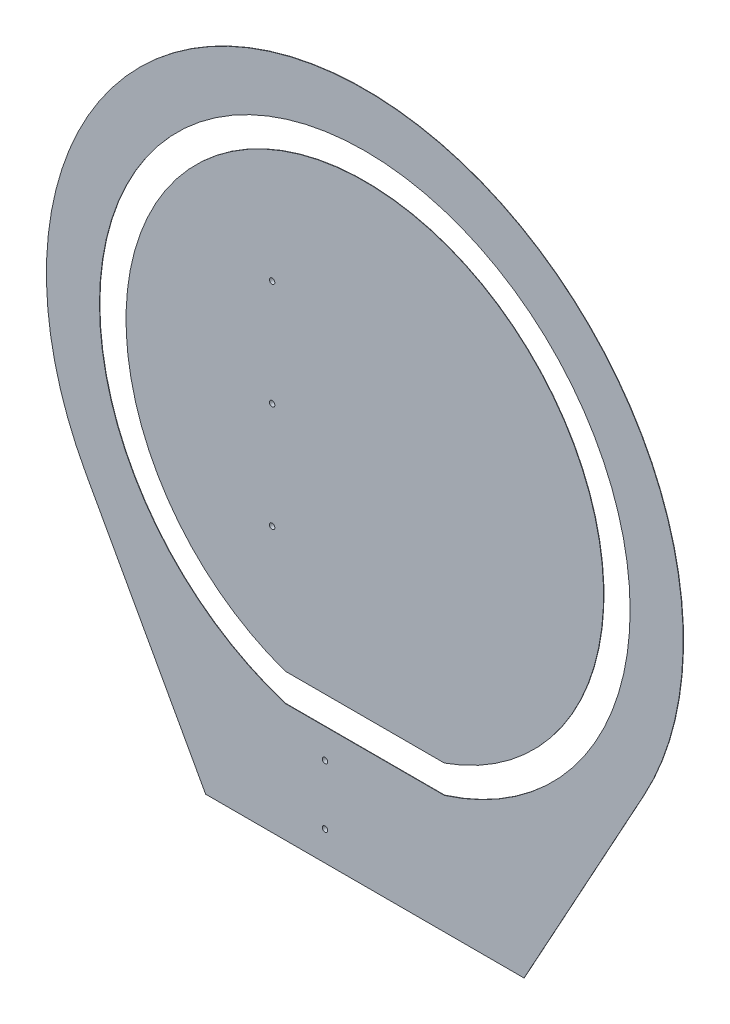
ISO-10303-21;
HEADER;
FILE_DESCRIPTION(('STEP AP214'),'2;1');
FILE_NAME('part.step','',(''),(''),'','','');
FILE_SCHEMA(('AUTOMOTIVE_DESIGN { 1 0 10303 214 1 1 1 1 }'));
ENDSEC;
DATA;
#1=APPLICATION_CONTEXT('core data for automotive mechanical design processes');
#2=APPLICATION_PROTOCOL_DEFINITION('international standard','automotive_design',2000,#1);
#3=PRODUCT_CONTEXT('',#1,'mechanical');
#4=PRODUCT('Part','Part','',(#3));
#5=PRODUCT_RELATED_PRODUCT_CATEGORY('part','',(#4));
#6=PRODUCT_DEFINITION_FORMATION('','',#4);
#7=PRODUCT_DEFINITION_CONTEXT('part definition',#1,'design');
#8=PRODUCT_DEFINITION('design','',#6,#7);
#9=PRODUCT_DEFINITION_SHAPE('','',#8);
#10=(LENGTH_UNIT() NAMED_UNIT(*) SI_UNIT(.MILLI.,.METRE.));
#11=(NAMED_UNIT(*) PLANE_ANGLE_UNIT() SI_UNIT($,.RADIAN.));
#12=(NAMED_UNIT(*) SI_UNIT($,.STERADIAN.) SOLID_ANGLE_UNIT());
#13=UNCERTAINTY_MEASURE_WITH_UNIT(LENGTH_MEASURE(1.E-05),#10,'distance_accuracy_value','');
#14=(GEOMETRIC_REPRESENTATION_CONTEXT(3) GLOBAL_UNCERTAINTY_ASSIGNED_CONTEXT((#13)) GLOBAL_UNIT_ASSIGNED_CONTEXT((#10,
#11,#12)) REPRESENTATION_CONTEXT('',''));
#15=CARTESIAN_POINT('',(0.,0.,0.));
#16=DIRECTION('',(0.,0.,1.));
#17=DIRECTION('',(1.,0.,0.));
#18=AXIS2_PLACEMENT_3D('',#15,#16,#17);
#19=CARTESIAN_POINT('',(0.,0.,0.));
#20=DIRECTION('',(0.,0.,1.));
#21=DIRECTION('',(1.,0.,0.));
#22=AXIS2_PLACEMENT_3D('',#19,#20,#21);
#23=PLANE('',#22);
#24=CARTESIAN_POINT('',(-3.7500000022113,-26.6242400340328,0.));
#25=DIRECTION('',(0.,0.,1.));
#26=DIRECTION('',(1.,0.,0.));
#27=AXIS2_PLACEMENT_3D('',#24,#25,#26);
#28=CIRCLE('',#27,0.27178);
#29=CARTESIAN_POINT('',(-3.4782200022113,-26.6242400340328,0.));
#30=VERTEX_POINT('',#29);
#31=EDGE_CURVE('E82',#30,#30,#28,.F.);
#32=ORIENTED_EDGE('',*,*,#31,.F.);
#33=EDGE_LOOP('',(#32));
#34=FACE_BOUND('',#33,.T.);
#35=DIRECTION('',(1.,0.,0.));
#36=VECTOR('',#35,1.);
#37=CARTESIAN_POINT('',(0.,-35.0000000340328,0.));
#38=LINE('',#37,#36);
#39=CARTESIAN_POINT('',(-15.,-35.0000000340328,0.));
#40=VERTEX_POINT('',#39);
#41=CARTESIAN_POINT('',(15.,-35.0000000340328,0.));
#42=VERTEX_POINT('',#41);
#43=EDGE_CURVE('E163',#40,#42,#38,.T.);
#44=ORIENTED_EDGE('',*,*,#43,.F.);
#45=DIRECTION('',(-0.481530218707047,0.876429488591035,0.));
#46=VECTOR('',#45,1.);
#47=CARTESIAN_POINT('',(-26.2928846577311,-14.4459065612114,0.));
#48=LINE('',#47,#46);
#49=CARTESIAN_POINT('',(-26.2928846577311,-14.4459065612114,0.));
#50=VERTEX_POINT('',#49);
#51=EDGE_CURVE('E138',#40,#50,#48,.T.);
#52=ORIENTED_EDGE('',*,*,#51,.T.);
#53=CARTESIAN_POINT('',(0.,0.,0.));
#54=DIRECTION('',(0.,0.,1.));
#55=DIRECTION('',(1.,0.,0.));
#56=AXIS2_PLACEMENT_3D('',#53,#54,#55);
#57=CIRCLE('',#56,30.);
#58=CARTESIAN_POINT('',(26.2928846577311,-14.4459065612114,0.));
#59=VERTEX_POINT('',#58);
#60=EDGE_CURVE('E168',#59,#50,#57,.T.);
#61=ORIENTED_EDGE('',*,*,#60,.F.);
#62=DIRECTION('',(0.481530218707047,0.876429488591035,0.));
#63=VECTOR('',#62,1.);
#64=CARTESIAN_POINT('',(26.2928846577311,-14.4459065612114,0.));
#65=LINE('',#64,#63);
#66=EDGE_CURVE('E165',#42,#59,#65,.T.);
#67=ORIENTED_EDGE('',*,*,#66,.F.);
#68=EDGE_LOOP('',(#44,#52,#61,#67));
#69=FACE_BOUND('',#68,.T.);
#70=CARTESIAN_POINT('',(0.,0.,0.));
#71=DIRECTION('',(0.,0.,1.));
#72=DIRECTION('',(1.,0.,0.));
#73=AXIS2_PLACEMENT_3D('',#70,#71,#72);
#74=CIRCLE('',#73,25.);
#75=CARTESIAN_POINT('',(7.50000000442261,-23.8484800340328,0.));
#76=VERTEX_POINT('',#75);
#77=CARTESIAN_POINT('',(-7.50000000442261,-23.8484800340328,0.));
#78=VERTEX_POINT('',#77);
#79=EDGE_CURVE('E172',#76,#78,#74,.T.);
#80=ORIENTED_EDGE('',*,*,#79,.T.);
#81=DIRECTION('',(1.,0.,0.));
#82=VECTOR('',#81,1.);
#83=CARTESIAN_POINT('',(0.,-23.8484800340328,0.));
#84=LINE('',#83,#82);
#85=EDGE_CURVE('E149',#78,#76,#84,.T.);
#86=ORIENTED_EDGE('',*,*,#85,.T.);
#87=EDGE_LOOP('',(#80,#86));
#88=FACE_BOUND('',#87,.T.);
#89=CARTESIAN_POINT('',(-3.7500000022113,-32.2242400340328,0.));
#90=DIRECTION('',(0.,0.,1.));
#91=DIRECTION('',(1.,0.,0.));
#92=AXIS2_PLACEMENT_3D('',#89,#90,#91);
#93=CIRCLE('',#92,0.271780000000001);
#94=CARTESIAN_POINT('',(-3.4782200022113,-32.2242400340328,0.));
#95=VERTEX_POINT('',#94);
#96=EDGE_CURVE('E13',#95,#95,#93,.F.);
#97=ORIENTED_EDGE('',*,*,#96,.F.);
#98=EDGE_LOOP('',(#97));
#99=FACE_BOUND('',#98,.T.);
#100=ADVANCED_FACE('F73',(#34,#69,#88,#99),#23,.F.);
#101=CARTESIAN_POINT('',(0.,0.,0.03556));
#102=DIRECTION('',(0.,0.,-1.));
#103=DIRECTION('',(-1.,0.,0.));
#104=AXIS2_PLACEMENT_3D('',#101,#102,#103);
#105=CYLINDRICAL_SURFACE('',#104,25.);
#106=ORIENTED_EDGE('',*,*,#79,.F.);
#107=DIRECTION('',(0.,0.,-1.));
#108=VECTOR('',#107,1.);
#109=CARTESIAN_POINT('',(7.50000000442261,-23.8484800340328,0.03556));
#110=LINE('',#109,#108);
#111=CARTESIAN_POINT('',(7.50000000442261,-23.8484800340328,0.03556));
#112=VERTEX_POINT('',#111);
#113=EDGE_CURVE('E110',#112,#76,#110,.T.);
#114=ORIENTED_EDGE('',*,*,#113,.F.);
#115=CARTESIAN_POINT('',(0.,0.,0.03556));
#116=DIRECTION('',(0.,0.,1.));
#117=DIRECTION('',(1.,0.,0.));
#118=AXIS2_PLACEMENT_3D('',#115,#116,#117);
#119=CIRCLE('',#118,25.);
#120=CARTESIAN_POINT('',(-7.50000000442261,-23.8484800340328,0.03556));
#121=VERTEX_POINT('',#120);
#122=EDGE_CURVE('E156',#112,#121,#119,.T.);
#123=ORIENTED_EDGE('',*,*,#122,.T.);
#124=DIRECTION('',(0.,0.,-1.));
#125=VECTOR('',#124,1.);
#126=CARTESIAN_POINT('',(-7.50000000442261,-23.8484800340328,0.03556));
#127=LINE('',#126,#125);
#128=EDGE_CURVE('E90',#121,#78,#127,.T.);
#129=ORIENTED_EDGE('',*,*,#128,.T.);
#130=EDGE_LOOP('',(#106,#114,#123,#129));
#131=FACE_BOUND('',#130,.T.);
#132=ADVANCED_FACE('F189',(#131),#105,.F.);
#133=CARTESIAN_POINT('',(0.,-35.0000000340328,0.03556));
#134=DIRECTION('',(0.,1.,0.));
#135=DIRECTION('',(-1.,0.,0.));
#136=AXIS2_PLACEMENT_3D('',#133,#134,#135);
#137=PLANE('',#136);
#138=ORIENTED_EDGE('',*,*,#43,.T.);
#139=DIRECTION('',(0.,0.,-1.));
#140=VECTOR('',#139,1.);
#141=CARTESIAN_POINT('',(15.,-35.0000000340328,0.03556));
#142=LINE('',#141,#140);
#143=CARTESIAN_POINT('',(15.,-35.0000000340328,0.03556));
#144=VERTEX_POINT('',#143);
#145=EDGE_CURVE('E147',#144,#42,#142,.T.);
#146=ORIENTED_EDGE('',*,*,#145,.F.);
#147=DIRECTION('',(1.,0.,0.));
#148=VECTOR('',#147,1.);
#149=CARTESIAN_POINT('',(0.,-35.0000000340328,0.03556));
#150=LINE('',#149,#148);
#151=CARTESIAN_POINT('',(-15.,-35.0000000340328,0.03556));
#152=VERTEX_POINT('',#151);
#153=EDGE_CURVE('E146',#152,#144,#150,.T.);
#154=ORIENTED_EDGE('',*,*,#153,.F.);
#155=DIRECTION('',(0.,0.,-1.));
#156=VECTOR('',#155,1.);
#157=CARTESIAN_POINT('',(-15.,-35.0000000340328,0.03556));
#158=LINE('',#157,#156);
#159=EDGE_CURVE('E132',#152,#40,#158,.T.);
#160=ORIENTED_EDGE('',*,*,#159,.T.);
#161=EDGE_LOOP('',(#138,#146,#154,#160));
#162=FACE_BOUND('',#161,.T.);
#163=ADVANCED_FACE('F75',(#162),#137,.F.);
#164=CARTESIAN_POINT('',(26.2928846577311,-14.4459065612114,0.03556));
#165=DIRECTION('',(-0.876429488591035,0.481530218707047,0.));
#166=DIRECTION('',(-0.481530218707047,-0.876429488591036,0.));
#167=AXIS2_PLACEMENT_3D('',#164,#165,#166);
#168=PLANE('',#167);
#169=ORIENTED_EDGE('',*,*,#66,.T.);
#170=DIRECTION('',(0.,0.,-1.));
#171=VECTOR('',#170,1.);
#172=CARTESIAN_POINT('',(26.2928846577311,-14.4459065612114,0.03556));
#173=LINE('',#172,#171);
#174=CARTESIAN_POINT('',(26.2928846577311,-14.4459065612114,0.03556));
#175=VERTEX_POINT('',#174);
#176=EDGE_CURVE('E179',#175,#59,#173,.T.);
#177=ORIENTED_EDGE('',*,*,#176,.F.);
#178=DIRECTION('',(0.481530218707047,0.876429488591035,0.));
#179=VECTOR('',#178,1.);
#180=CARTESIAN_POINT('',(26.2928846577311,-14.4459065612114,0.03556));
#181=LINE('',#180,#179);
#182=EDGE_CURVE('E122',#144,#175,#181,.T.);
#183=ORIENTED_EDGE('',*,*,#182,.F.);
#184=ORIENTED_EDGE('',*,*,#145,.T.);
#185=EDGE_LOOP('',(#169,#177,#183,#184));
#186=FACE_BOUND('',#185,.T.);
#187=ADVANCED_FACE('F234',(#186),#168,.F.);
#188=CARTESIAN_POINT('',(0.,0.,0.03556));
#189=DIRECTION('',(0.,0.,-1.));
#190=DIRECTION('',(-1.,0.,0.));
#191=AXIS2_PLACEMENT_3D('',#188,#189,#190);
#192=CYLINDRICAL_SURFACE('',#191,30.);
#193=ORIENTED_EDGE('',*,*,#60,.T.);
#194=DIRECTION('',(0.,0.,-1.));
#195=VECTOR('',#194,1.);
#196=CARTESIAN_POINT('',(-26.2928846577311,-14.4459065612114,0.03556));
#197=LINE('',#196,#195);
#198=CARTESIAN_POINT('',(-26.2928846577311,-14.4459065612114,0.03556));
#199=VERTEX_POINT('',#198);
#200=EDGE_CURVE('E142',#199,#50,#197,.T.);
#201=ORIENTED_EDGE('',*,*,#200,.F.);
#202=CARTESIAN_POINT('',(0.,0.,0.03556));
#203=DIRECTION('',(0.,0.,1.));
#204=DIRECTION('',(1.,0.,0.));
#205=AXIS2_PLACEMENT_3D('',#202,#203,#204);
#206=CIRCLE('',#205,30.);
#207=EDGE_CURVE('E154',#175,#199,#206,.T.);
#208=ORIENTED_EDGE('',*,*,#207,.F.);
#209=ORIENTED_EDGE('',*,*,#176,.T.);
#210=EDGE_LOOP('',(#193,#201,#208,#209));
#211=FACE_BOUND('',#210,.T.);
#212=ADVANCED_FACE('F232',(#211),#192,.T.);
#213=CARTESIAN_POINT('',(-26.2928846577311,-14.4459065612114,0.03556));
#214=DIRECTION('',(-0.876429488591035,-0.481530218707047,0.));
#215=DIRECTION('',(0.481530218707047,-0.876429488591035,0.));
#216=AXIS2_PLACEMENT_3D('',#213,#214,#215);
#217=PLANE('',#216);
#218=ORIENTED_EDGE('',*,*,#51,.F.);
#219=ORIENTED_EDGE('',*,*,#159,.F.);
#220=DIRECTION('',(-0.481530218707047,0.876429488591035,0.));
#221=VECTOR('',#220,1.);
#222=CARTESIAN_POINT('',(-26.2928846577311,-14.4459065612114,0.03556));
#223=LINE('',#222,#221);
#224=EDGE_CURVE('E136',#152,#199,#223,.T.);
#225=ORIENTED_EDGE('',*,*,#224,.T.);
#226=ORIENTED_EDGE('',*,*,#200,.T.);
#227=EDGE_LOOP('',(#218,#219,#225,#226));
#228=FACE_BOUND('',#227,.T.);
#229=ADVANCED_FACE('F134',(#228),#217,.T.);
#230=CARTESIAN_POINT('',(0.,-23.8484800340328,0.03556));
#231=DIRECTION('',(0.,1.,0.));
#232=DIRECTION('',(0.,0.,1.));
#233=AXIS2_PLACEMENT_3D('',#230,#231,#232);
#234=PLANE('',#233);
#235=ORIENTED_EDGE('',*,*,#85,.F.);
#236=ORIENTED_EDGE('',*,*,#128,.F.);
#237=DIRECTION('',(1.,0.,0.));
#238=VECTOR('',#237,1.);
#239=CARTESIAN_POINT('',(0.,-23.8484800340328,0.03556));
#240=LINE('',#239,#238);
#241=EDGE_CURVE('E143',#121,#112,#240,.T.);
#242=ORIENTED_EDGE('',*,*,#241,.T.);
#243=ORIENTED_EDGE('',*,*,#113,.T.);
#244=EDGE_LOOP('',(#235,#236,#242,#243));
#245=FACE_BOUND('',#244,.T.);
#246=ADVANCED_FACE('F223',(#245),#234,.T.);
#247=CARTESIAN_POINT('',(0.,0.,0.03556));
#248=DIRECTION('',(0.,0.,1.));
#249=DIRECTION('',(1.,0.,0.));
#250=AXIS2_PLACEMENT_3D('',#247,#248,#249);
#251=PLANE('',#250);
#252=CARTESIAN_POINT('',(-3.7500000022113,-32.2242400340328,0.03556));
#253=DIRECTION('',(0.,0.,1.));
#254=DIRECTION('',(1.,0.,0.));
#255=AXIS2_PLACEMENT_3D('',#252,#253,#254);
#256=CIRCLE('',#255,0.254000000000001);
#257=CARTESIAN_POINT('',(-3.4960000022113,-32.2242400340328,0.03556));
#258=VERTEX_POINT('',#257);
#259=EDGE_CURVE('E166',#258,#258,#256,.T.);
#260=ORIENTED_EDGE('',*,*,#259,.F.);
#261=EDGE_LOOP('',(#260));
#262=FACE_BOUND('',#261,.T.);
#263=CARTESIAN_POINT('',(-3.7500000022113,-26.6242400340328,0.03556));
#264=DIRECTION('',(0.,0.,1.));
#265=DIRECTION('',(1.,0.,0.));
#266=AXIS2_PLACEMENT_3D('',#263,#264,#265);
#267=CIRCLE('',#266,0.254);
#268=CARTESIAN_POINT('',(-3.4960000022113,-26.6242400340328,0.03556));
#269=VERTEX_POINT('',#268);
#270=EDGE_CURVE('E355',#269,#269,#267,.T.);
#271=ORIENTED_EDGE('',*,*,#270,.F.);
#272=EDGE_LOOP('',(#271));
#273=FACE_BOUND('',#272,.T.);
#274=ORIENTED_EDGE('',*,*,#153,.T.);
#275=ORIENTED_EDGE('',*,*,#182,.T.);
#276=ORIENTED_EDGE('',*,*,#207,.T.);
#277=ORIENTED_EDGE('',*,*,#224,.F.);
#278=EDGE_LOOP('',(#274,#275,#276,#277));
#279=FACE_BOUND('',#278,.T.);
#280=ORIENTED_EDGE('',*,*,#122,.F.);
#281=ORIENTED_EDGE('',*,*,#241,.F.);
#282=EDGE_LOOP('',(#280,#281));
#283=FACE_BOUND('',#282,.T.);
#284=ADVANCED_FACE('F151',(#262,#273,#279,#283),#251,.T.);
#285=CARTESIAN_POINT('',(-3.7500000022113,-26.6242400340328,-9.96444));
#286=DIRECTION('',(0.,0.,1.));
#287=DIRECTION('',(1.,0.,0.));
#288=AXIS2_PLACEMENT_3D('',#285,#286,#287);
#289=CYLINDRICAL_SURFACE('',#288,0.254);
#290=ORIENTED_EDGE('',*,*,#270,.T.);
#291=EDGE_LOOP('',(#290));
#292=FACE_BOUND('',#291,.T.);
#293=CARTESIAN_POINT('',(-3.7500000022113,-26.6242400340328,-0.75438));
#294=DIRECTION('',(0.,0.,-1.));
#295=DIRECTION('',(-1.,0.,0.));
#296=AXIS2_PLACEMENT_3D('',#293,#294,#295);
#297=CIRCLE('',#296,0.253999999999999);
#298=CARTESIAN_POINT('',(-4.0040000022113,-26.6242400340328,-0.75438));
#299=VERTEX_POINT('',#298);
#300=EDGE_CURVE('E356',#299,#299,#297,.T.);
#301=ORIENTED_EDGE('',*,*,#300,.T.);
#302=EDGE_LOOP('',(#301));
#303=FACE_BOUND('',#302,.T.);
#304=ADVANCED_FACE('F217',(#292,#303),#289,.F.);
#305=CARTESIAN_POINT('',(-3.7500000022113,-32.2242400340328,-9.96444));
#306=DIRECTION('',(0.,0.,1.));
#307=DIRECTION('',(1.,0.,0.));
#308=AXIS2_PLACEMENT_3D('',#305,#306,#307);
#309=CYLINDRICAL_SURFACE('',#308,0.254000000000001);
#310=ORIENTED_EDGE('',*,*,#259,.T.);
#311=EDGE_LOOP('',(#310));
#312=FACE_BOUND('',#311,.T.);
#313=CARTESIAN_POINT('',(-3.7500000022113,-32.2242400340328,-0.75438));
#314=DIRECTION('',(0.,0.,-1.));
#315=DIRECTION('',(-1.,0.,0.));
#316=AXIS2_PLACEMENT_3D('',#313,#314,#315);
#317=CIRCLE('',#316,0.254000000000002);
#318=CARTESIAN_POINT('',(-4.00400000221131,-32.2242400340328,-0.75438));
#319=VERTEX_POINT('',#318);
#320=EDGE_CURVE('E365',#319,#319,#317,.T.);
#321=ORIENTED_EDGE('',*,*,#320,.T.);
#322=EDGE_LOOP('',(#321));
#323=FACE_BOUND('',#322,.T.);
#324=ADVANCED_FACE('F213',(#312,#323),#309,.F.);
#325=CARTESIAN_POINT('',(-3.7500000022113,-26.6242400340328,-0.75438));
#326=DIRECTION('',(0.,0.,-1.));
#327=DIRECTION('',(-1.,0.,0.));
#328=AXIS2_PLACEMENT_3D('',#325,#326,#327);
#329=PLANE('',#328);
#330=CARTESIAN_POINT('',(-3.7500000022113,-26.6242400340328,-0.75438));
#331=DIRECTION('',(0.,0.,-1.));
#332=DIRECTION('',(-1.,0.,0.));
#333=AXIS2_PLACEMENT_3D('',#330,#331,#332);
#334=CIRCLE('',#333,0.27178);
#335=CARTESIAN_POINT('',(-4.0217800022113,-26.6242400340328,-0.75438));
#336=VERTEX_POINT('',#335);
#337=EDGE_CURVE('E360',#336,#336,#334,.T.);
#338=ORIENTED_EDGE('',*,*,#337,.T.);
#339=EDGE_LOOP('',(#338));
#340=FACE_BOUND('',#339,.T.);
#341=ORIENTED_EDGE('',*,*,#300,.F.);
#342=EDGE_LOOP('',(#341));
#343=FACE_BOUND('',#342,.T.);
#344=ADVANCED_FACE('F209',(#340,#343),#329,.T.);
#345=CARTESIAN_POINT('',(-3.7500000022113,-26.6242400340328,-0.75438));
#346=DIRECTION('',(0.,0.,1.));
#347=DIRECTION('',(1.,0.,0.));
#348=AXIS2_PLACEMENT_3D('',#345,#346,#347);
#349=CYLINDRICAL_SURFACE('',#348,0.27178);
#350=ORIENTED_EDGE('',*,*,#337,.F.);
#351=EDGE_LOOP('',(#350));
#352=FACE_BOUND('',#351,.T.);
#353=ORIENTED_EDGE('',*,*,#31,.T.);
#354=EDGE_LOOP('',(#353));
#355=FACE_BOUND('',#354,.T.);
#356=ADVANCED_FACE('F185',(#352,#355),#349,.T.);
#357=CARTESIAN_POINT('',(-3.7500000022113,-32.2242400340328,-0.75438));
#358=DIRECTION('',(0.,0.,-1.));
#359=DIRECTION('',(-1.,0.,0.));
#360=AXIS2_PLACEMENT_3D('',#357,#358,#359);
#361=PLANE('',#360);
#362=CARTESIAN_POINT('',(-3.7500000022113,-32.2242400340328,-0.75438));
#363=DIRECTION('',(0.,0.,-1.));
#364=DIRECTION('',(-1.,0.,0.));
#365=AXIS2_PLACEMENT_3D('',#362,#363,#364);
#366=CIRCLE('',#365,0.271780000000001);
#367=CARTESIAN_POINT('',(-4.0217800022113,-32.2242400340328,-0.75438));
#368=VERTEX_POINT('',#367);
#369=EDGE_CURVE('E368',#368,#368,#366,.T.);
#370=ORIENTED_EDGE('',*,*,#369,.T.);
#371=EDGE_LOOP('',(#370));
#372=FACE_BOUND('',#371,.T.);
#373=ORIENTED_EDGE('',*,*,#320,.F.);
#374=EDGE_LOOP('',(#373));
#375=FACE_BOUND('',#374,.T.);
#376=ADVANCED_FACE('F197',(#372,#375),#361,.T.);
#377=CARTESIAN_POINT('',(-3.7500000022113,-32.2242400340328,-0.75438));
#378=DIRECTION('',(0.,0.,1.));
#379=DIRECTION('',(1.,0.,0.));
#380=AXIS2_PLACEMENT_3D('',#377,#378,#379);
#381=CYLINDRICAL_SURFACE('',#380,0.271780000000001);
#382=ORIENTED_EDGE('',*,*,#369,.F.);
#383=EDGE_LOOP('',(#382));
#384=FACE_BOUND('',#383,.T.);
#385=ORIENTED_EDGE('',*,*,#96,.T.);
#386=EDGE_LOOP('',(#385));
#387=FACE_BOUND('',#386,.T.);
#388=ADVANCED_FACE('F195',(#384,#387),#381,.T.);
#389=CLOSED_SHELL('',(#100,#132,#163,#187,#212,#229,#246,#284,#304,#324,#344,#356,#376,#388));
#390=MANIFOLD_SOLID_BREP('B2',#389);
#391=CARTESIAN_POINT('',(0.,0.,0.));
#392=DIRECTION('',(0.,0.,1.));
#393=DIRECTION('',(1.,0.,0.));
#394=AXIS2_PLACEMENT_3D('',#391,#392,#393);
#395=PLANE('',#394);
#396=CARTESIAN_POINT('',(-8.7337921484793,0.,0.));
#397=DIRECTION('',(0.,0.,1.));
#398=DIRECTION('',(1.,0.,0.));
#399=AXIS2_PLACEMENT_3D('',#396,#397,#398);
#400=CIRCLE('',#399,0.27178);
#401=CARTESIAN_POINT('',(-8.4620121484793,0.,0.));
#402=VERTEX_POINT('',#401);
#403=EDGE_CURVE('E390',#402,#402,#400,.F.);
#404=ORIENTED_EDGE('',*,*,#403,.F.);
#405=EDGE_LOOP('',(#404));
#406=FACE_BOUND('',#405,.T.);
#407=DIRECTION('',(1.,0.,0.));
#408=VECTOR('',#407,1.);
#409=CARTESIAN_POINT('',(0.,-21.2132034340328,0.));
#410=LINE('',#409,#408);
#411=CARTESIAN_POINT('',(-7.50000000442261,-21.2132034340328,0.));
#412=VERTEX_POINT('',#411);
#413=CARTESIAN_POINT('',(7.50000000442261,-21.2132034340328,0.));
#414=VERTEX_POINT('',#413);
#415=EDGE_CURVE('E417',#412,#414,#410,.T.);
#416=ORIENTED_EDGE('',*,*,#415,.F.);
#417=CARTESIAN_POINT('',(0.,0.,0.));
#418=DIRECTION('',(0.,0.,1.));
#419=DIRECTION('',(1.,0.,0.));
#420=AXIS2_PLACEMENT_3D('',#417,#418,#419);
#421=CIRCLE('',#420,22.5);
#422=EDGE_CURVE('E405',#414,#412,#421,.T.);
#423=ORIENTED_EDGE('',*,*,#422,.F.);
#424=EDGE_LOOP('',(#416,#423));
#425=FACE_BOUND('',#424,.T.);
#426=CARTESIAN_POINT('',(-8.7337921484793,10.,0.));
#427=DIRECTION('',(0.,0.,1.));
#428=DIRECTION('',(1.,0.,0.));
#429=AXIS2_PLACEMENT_3D('',#426,#427,#428);
#430=CIRCLE('',#429,0.27178);
#431=CARTESIAN_POINT('',(-8.46201214847929,10.,0.));
#432=VERTEX_POINT('',#431);
#433=EDGE_CURVE('E435',#432,#432,#430,.F.);
#434=ORIENTED_EDGE('',*,*,#433,.F.);
#435=EDGE_LOOP('',(#434));
#436=FACE_BOUND('',#435,.T.);
#437=CARTESIAN_POINT('',(-8.7337921484793,-10.,0.));
#438=DIRECTION('',(0.,0.,1.));
#439=DIRECTION('',(1.,0.,0.));
#440=AXIS2_PLACEMENT_3D('',#437,#438,#439);
#441=CIRCLE('',#440,0.27178);
#442=CARTESIAN_POINT('',(-8.46201214847929,-10.,0.));
#443=VERTEX_POINT('',#442);
#444=EDGE_CURVE('E71',#443,#443,#441,.F.);
#445=ORIENTED_EDGE('',*,*,#444,.F.);
#446=EDGE_LOOP('',(#445));
#447=FACE_BOUND('',#446,.T.);
#448=ADVANCED_FACE('F380',(#406,#425,#436,#447),#395,.F.);
#449=CARTESIAN_POINT('',(0.,-21.2132034340328,0.03556));
#450=DIRECTION('',(0.,1.,0.));
#451=DIRECTION('',(0.,0.,1.));
#452=AXIS2_PLACEMENT_3D('',#449,#450,#451);
#453=PLANE('',#452);
#454=ORIENTED_EDGE('',*,*,#415,.T.);
#455=DIRECTION('',(0.,0.,-1.));
#456=VECTOR('',#455,1.);
#457=CARTESIAN_POINT('',(7.50000000442261,-21.2132034340328,0.03556));
#458=LINE('',#457,#456);
#459=CARTESIAN_POINT('',(7.50000000442261,-21.2132034340328,0.03556));
#460=VERTEX_POINT('',#459);
#461=EDGE_CURVE('E413',#460,#414,#458,.T.);
#462=ORIENTED_EDGE('',*,*,#461,.F.);
#463=DIRECTION('',(1.,0.,0.));
#464=VECTOR('',#463,1.);
#465=CARTESIAN_POINT('',(0.,-21.2132034340328,0.03556));
#466=LINE('',#465,#464);
#467=CARTESIAN_POINT('',(-7.50000000442261,-21.2132034340328,0.03556));
#468=VERTEX_POINT('',#467);
#469=EDGE_CURVE('E416',#468,#460,#466,.T.);
#470=ORIENTED_EDGE('',*,*,#469,.F.);
#471=DIRECTION('',(0.,0.,-1.));
#472=VECTOR('',#471,1.);
#473=CARTESIAN_POINT('',(-7.50000000442261,-21.2132034340328,0.03556));
#474=LINE('',#473,#472);
#475=EDGE_CURVE('E410',#468,#412,#474,.T.);
#476=ORIENTED_EDGE('',*,*,#475,.T.);
#477=EDGE_LOOP('',(#454,#462,#470,#476));
#478=FACE_BOUND('',#477,.T.);
#479=ADVANCED_FACE('F382',(#478),#453,.F.);
#480=CARTESIAN_POINT('',(0.,0.,0.03556));
#481=DIRECTION('',(0.,0.,-1.));
#482=DIRECTION('',(-1.,0.,0.));
#483=AXIS2_PLACEMENT_3D('',#480,#481,#482);
#484=CYLINDRICAL_SURFACE('',#483,22.5);
#485=ORIENTED_EDGE('',*,*,#422,.T.);
#486=ORIENTED_EDGE('',*,*,#475,.F.);
#487=CARTESIAN_POINT('',(0.,0.,0.03556));
#488=DIRECTION('',(0.,0.,1.));
#489=DIRECTION('',(1.,0.,0.));
#490=AXIS2_PLACEMENT_3D('',#487,#488,#489);
#491=CIRCLE('',#490,22.5);
#492=EDGE_CURVE('E397',#460,#468,#491,.T.);
#493=ORIENTED_EDGE('',*,*,#492,.F.);
#494=ORIENTED_EDGE('',*,*,#461,.T.);
#495=EDGE_LOOP('',(#485,#486,#493,#494));
#496=FACE_BOUND('',#495,.T.);
#497=ADVANCED_FACE('F409',(#496),#484,.T.);
#498=CARTESIAN_POINT('',(0.,0.,0.03556));
#499=DIRECTION('',(0.,0.,1.));
#500=DIRECTION('',(1.,0.,0.));
#501=AXIS2_PLACEMENT_3D('',#498,#499,#500);
#502=PLANE('',#501);
#503=CARTESIAN_POINT('',(-8.7337921484793,-10.,0.03556));
#504=DIRECTION('',(0.,0.,1.));
#505=DIRECTION('',(1.,0.,0.));
#506=AXIS2_PLACEMENT_3D('',#503,#504,#505);
#507=CIRCLE('',#506,0.254000000000001);
#508=CARTESIAN_POINT('',(-8.47979214847929,-10.,0.03556));
#509=VERTEX_POINT('',#508);
#510=EDGE_CURVE('E424',#509,#509,#507,.T.);
#511=ORIENTED_EDGE('',*,*,#510,.F.);
#512=EDGE_LOOP('',(#511));
#513=FACE_BOUND('',#512,.T.);
#514=CARTESIAN_POINT('',(-8.7337921484793,0.,0.03556));
#515=DIRECTION('',(0.,0.,1.));
#516=DIRECTION('',(1.,0.,0.));
#517=AXIS2_PLACEMENT_3D('',#514,#515,#516);
#518=CIRCLE('',#517,0.254000000000001);
#519=CARTESIAN_POINT('',(-8.47979214847929,0.,0.03556));
#520=VERTEX_POINT('',#519);
#521=EDGE_CURVE('E428',#520,#520,#518,.T.);
#522=ORIENTED_EDGE('',*,*,#521,.F.);
#523=EDGE_LOOP('',(#522));
#524=FACE_BOUND('',#523,.T.);
#525=CARTESIAN_POINT('',(-8.7337921484793,10.,0.03556));
#526=DIRECTION('',(0.,0.,1.));
#527=DIRECTION('',(1.,0.,0.));
#528=AXIS2_PLACEMENT_3D('',#525,#526,#527);
#529=CIRCLE('',#528,0.254000000000001);
#530=CARTESIAN_POINT('',(-8.47979214847929,10.,0.03556));
#531=VERTEX_POINT('',#530);
#532=EDGE_CURVE('E471',#531,#531,#529,.T.);
#533=ORIENTED_EDGE('',*,*,#532,.F.);
#534=EDGE_LOOP('',(#533));
#535=FACE_BOUND('',#534,.T.);
#536=ORIENTED_EDGE('',*,*,#469,.T.);
#537=ORIENTED_EDGE('',*,*,#492,.T.);
#538=EDGE_LOOP('',(#536,#537));
#539=FACE_BOUND('',#538,.T.);
#540=ADVANCED_FACE('F452',(#513,#524,#535,#539),#502,.T.);
#541=CARTESIAN_POINT('',(-8.7337921484793,10.,-9.96444));
#542=DIRECTION('',(0.,0.,1.));
#543=DIRECTION('',(1.,0.,0.));
#544=AXIS2_PLACEMENT_3D('',#541,#542,#543);
#545=CYLINDRICAL_SURFACE('',#544,0.254000000000001);
#546=ORIENTED_EDGE('',*,*,#532,.T.);
#547=EDGE_LOOP('',(#546));
#548=FACE_BOUND('',#547,.T.);
#549=CARTESIAN_POINT('',(-8.7337921484793,10.,-0.75438));
#550=DIRECTION('',(0.,0.,-1.));
#551=DIRECTION('',(-1.,0.,0.));
#552=AXIS2_PLACEMENT_3D('',#549,#550,#551);
#553=CIRCLE('',#552,0.254000000000001);
#554=CARTESIAN_POINT('',(-8.9877921484793,10.,-0.75438));
#555=VERTEX_POINT('',#554);
#556=EDGE_CURVE('E483',#555,#555,#553,.T.);
#557=ORIENTED_EDGE('',*,*,#556,.T.);
#558=EDGE_LOOP('',(#557));
#559=FACE_BOUND('',#558,.T.);
#560=ADVANCED_FACE('F458',(#548,#559),#545,.F.);
#561=CARTESIAN_POINT('',(-8.7337921484793,0.,-9.96444));
#562=DIRECTION('',(0.,0.,1.));
#563=DIRECTION('',(1.,0.,0.));
#564=AXIS2_PLACEMENT_3D('',#561,#562,#563);
#565=CYLINDRICAL_SURFACE('',#564,0.254000000000001);
#566=ORIENTED_EDGE('',*,*,#521,.T.);
#567=EDGE_LOOP('',(#566));
#568=FACE_BOUND('',#567,.T.);
#569=CARTESIAN_POINT('',(-8.7337921484793,0.,-0.75438));
#570=DIRECTION('',(0.,0.,-1.));
#571=DIRECTION('',(-1.,0.,0.));
#572=AXIS2_PLACEMENT_3D('',#569,#570,#571);
#573=CIRCLE('',#572,0.253999999999999);
#574=CARTESIAN_POINT('',(-8.9877921484793,0.,-0.75438));
#575=VERTEX_POINT('',#574);
#576=EDGE_CURVE('E487',#575,#575,#573,.T.);
#577=ORIENTED_EDGE('',*,*,#576,.T.);
#578=EDGE_LOOP('',(#577));
#579=FACE_BOUND('',#578,.T.);
#580=ADVANCED_FACE('F462',(#568,#579),#565,.F.);
#581=CARTESIAN_POINT('',(-8.7337921484793,-10.,-9.96444));
#582=DIRECTION('',(0.,0.,1.));
#583=DIRECTION('',(1.,0.,0.));
#584=AXIS2_PLACEMENT_3D('',#581,#582,#583);
#585=CYLINDRICAL_SURFACE('',#584,0.254000000000001);
#586=ORIENTED_EDGE('',*,*,#510,.T.);
#587=EDGE_LOOP('',(#586));
#588=FACE_BOUND('',#587,.T.);
#589=CARTESIAN_POINT('',(-8.7337921484793,-10.,-0.75438));
#590=DIRECTION('',(0.,0.,-1.));
#591=DIRECTION('',(-1.,0.,0.));
#592=AXIS2_PLACEMENT_3D('',#589,#590,#591);
#593=CIRCLE('',#592,0.254000000000001);
#594=CARTESIAN_POINT('',(-8.9877921484793,-10.,-0.75438));
#595=VERTEX_POINT('',#594);
#596=EDGE_CURVE('E495',#595,#595,#593,.T.);
#597=ORIENTED_EDGE('',*,*,#596,.T.);
#598=EDGE_LOOP('',(#597));
#599=FACE_BOUND('',#598,.T.);
#600=ADVANCED_FACE('F529',(#588,#599),#585,.F.);
#601=CARTESIAN_POINT('',(-8.7337921484793,10.,-0.75438));
#602=DIRECTION('',(0.,0.,-1.));
#603=DIRECTION('',(-1.,0.,0.));
#604=AXIS2_PLACEMENT_3D('',#601,#602,#603);
#605=PLANE('',#604);
#606=CARTESIAN_POINT('',(-8.7337921484793,10.,-0.75438));
#607=DIRECTION('',(0.,0.,-1.));
#608=DIRECTION('',(-1.,0.,0.));
#609=AXIS2_PLACEMENT_3D('',#606,#607,#608);
#610=CIRCLE('',#609,0.27178);
#611=CARTESIAN_POINT('',(-9.0055721484793,10.,-0.75438));
#612=VERTEX_POINT('',#611);
#613=EDGE_CURVE('E477',#612,#612,#610,.T.);
#614=ORIENTED_EDGE('',*,*,#613,.T.);
#615=EDGE_LOOP('',(#614));
#616=FACE_BOUND('',#615,.T.);
#617=ORIENTED_EDGE('',*,*,#556,.F.);
#618=EDGE_LOOP('',(#617));
#619=FACE_BOUND('',#618,.T.);
#620=ADVANCED_FACE('F526',(#616,#619),#605,.T.);
#621=CARTESIAN_POINT('',(-8.7337921484793,10.,-0.75438));
#622=DIRECTION('',(0.,0.,1.));
#623=DIRECTION('',(1.,0.,0.));
#624=AXIS2_PLACEMENT_3D('',#621,#622,#623);
#625=CYLINDRICAL_SURFACE('',#624,0.27178);
#626=ORIENTED_EDGE('',*,*,#613,.F.);
#627=EDGE_LOOP('',(#626));
#628=FACE_BOUND('',#627,.T.);
#629=ORIENTED_EDGE('',*,*,#433,.T.);
#630=EDGE_LOOP('',(#629));
#631=FACE_BOUND('',#630,.T.);
#632=ADVANCED_FACE('F524',(#628,#631),#625,.T.);
#633=CARTESIAN_POINT('',(-8.7337921484793,0.,-0.75438));
#634=DIRECTION('',(0.,0.,-1.));
#635=DIRECTION('',(-1.,0.,0.));
#636=AXIS2_PLACEMENT_3D('',#633,#634,#635);
#637=PLANE('',#636);
#638=CARTESIAN_POINT('',(-8.7337921484793,0.,-0.75438));
#639=DIRECTION('',(0.,0.,-1.));
#640=DIRECTION('',(-1.,0.,0.));
#641=AXIS2_PLACEMENT_3D('',#638,#639,#640);
#642=CIRCLE('',#641,0.27178);
#643=CARTESIAN_POINT('',(-9.0055721484793,0.,-0.75438));
#644=VERTEX_POINT('',#643);
#645=EDGE_CURVE('E491',#644,#644,#642,.T.);
#646=ORIENTED_EDGE('',*,*,#645,.T.);
#647=EDGE_LOOP('',(#646));
#648=FACE_BOUND('',#647,.T.);
#649=ORIENTED_EDGE('',*,*,#576,.F.);
#650=EDGE_LOOP('',(#649));
#651=FACE_BOUND('',#650,.T.);
#652=ADVANCED_FACE('F520',(#648,#651),#637,.T.);
#653=CARTESIAN_POINT('',(-8.7337921484793,0.,-0.75438));
#654=DIRECTION('',(0.,0.,1.));
#655=DIRECTION('',(1.,0.,0.));
#656=AXIS2_PLACEMENT_3D('',#653,#654,#655);
#657=CYLINDRICAL_SURFACE('',#656,0.27178);
#658=ORIENTED_EDGE('',*,*,#645,.F.);
#659=EDGE_LOOP('',(#658));
#660=FACE_BOUND('',#659,.T.);
#661=ORIENTED_EDGE('',*,*,#403,.T.);
#662=EDGE_LOOP('',(#661));
#663=FACE_BOUND('',#662,.T.);
#664=ADVANCED_FACE('F442',(#660,#663),#657,.T.);
#665=CARTESIAN_POINT('',(-8.7337921484793,-10.,-0.75438));
#666=DIRECTION('',(0.,0.,-1.));
#667=DIRECTION('',(-1.,0.,0.));
#668=AXIS2_PLACEMENT_3D('',#665,#666,#667);
#669=PLANE('',#668);
#670=CARTESIAN_POINT('',(-8.7337921484793,-10.,-0.75438));
#671=DIRECTION('',(0.,0.,-1.));
#672=DIRECTION('',(-1.,0.,0.));
#673=AXIS2_PLACEMENT_3D('',#670,#671,#672);
#674=CIRCLE('',#673,0.27178);
#675=CARTESIAN_POINT('',(-9.0055721484793,-10.,-0.75438));
#676=VERTEX_POINT('',#675);
#677=EDGE_CURVE('E499',#676,#676,#674,.T.);
#678=ORIENTED_EDGE('',*,*,#677,.T.);
#679=EDGE_LOOP('',(#678));
#680=FACE_BOUND('',#679,.T.);
#681=ORIENTED_EDGE('',*,*,#596,.F.);
#682=EDGE_LOOP('',(#681));
#683=FACE_BOUND('',#682,.T.);
#684=ADVANCED_FACE('F504',(#680,#683),#669,.T.);
#685=CARTESIAN_POINT('',(-8.7337921484793,-10.,-0.75438));
#686=DIRECTION('',(0.,0.,1.));
#687=DIRECTION('',(1.,0.,0.));
#688=AXIS2_PLACEMENT_3D('',#685,#686,#687);
#689=CYLINDRICAL_SURFACE('',#688,0.27178);
#690=ORIENTED_EDGE('',*,*,#677,.F.);
#691=EDGE_LOOP('',(#690));
#692=FACE_BOUND('',#691,.T.);
#693=ORIENTED_EDGE('',*,*,#444,.T.);
#694=EDGE_LOOP('',(#693));
#695=FACE_BOUND('',#694,.T.);
#696=ADVANCED_FACE('F507',(#692,#695),#689,.T.);
#697=CLOSED_SHELL('',(#448,#479,#497,#540,#560,#580,#600,#620,#632,#652,#664,#684,#696));
#698=MANIFOLD_SOLID_BREP('B7',#697);
#699=ADVANCED_BREP_SHAPE_REPRESENTATION('',(#18,#390,#698),#14);
#700=SHAPE_DEFINITION_REPRESENTATION(#9,#699);
ENDSEC;
END-ISO-10303-21;
